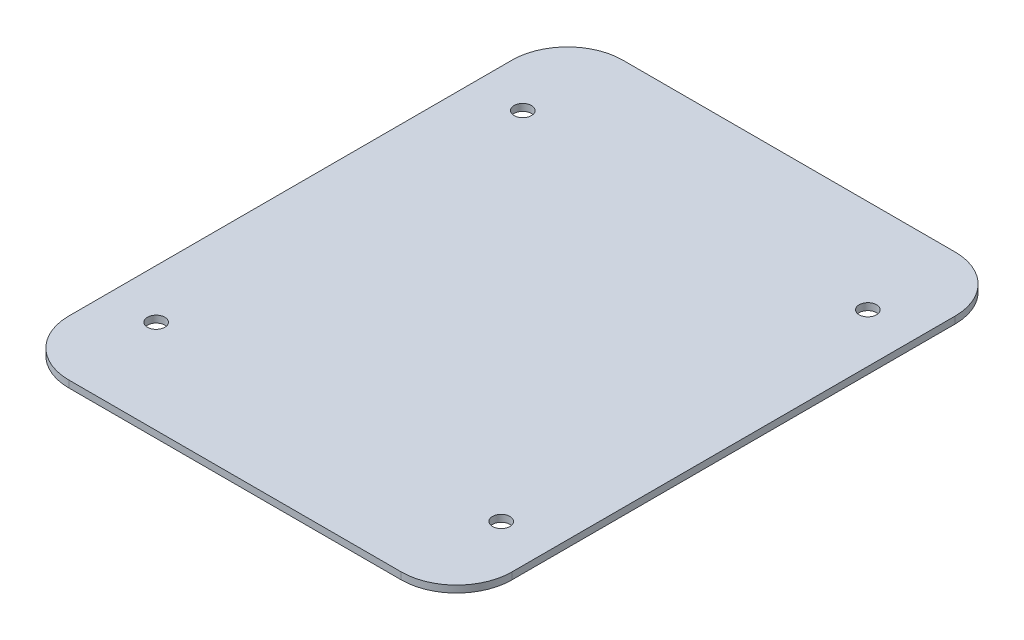
ISO-10303-21;
HEADER;
FILE_DESCRIPTION(('STEP AP214'),'2;1');
FILE_NAME('part.step','',(''),(''),'','','');
FILE_SCHEMA(('AUTOMOTIVE_DESIGN { 1 0 10303 214 1 1 1 1 }'));
ENDSEC;
DATA;
#1=APPLICATION_CONTEXT('core data for automotive mechanical design processes');
#2=APPLICATION_PROTOCOL_DEFINITION('international standard','automotive_design',2000,#1);
#3=PRODUCT_CONTEXT('',#1,'mechanical');
#4=PRODUCT('Part','Part','',(#3));
#5=PRODUCT_RELATED_PRODUCT_CATEGORY('part','',(#4));
#6=PRODUCT_DEFINITION_FORMATION('','',#4);
#7=PRODUCT_DEFINITION_CONTEXT('part definition',#1,'design');
#8=PRODUCT_DEFINITION('design','',#6,#7);
#9=PRODUCT_DEFINITION_SHAPE('','',#8);
#10=(LENGTH_UNIT() NAMED_UNIT(*) SI_UNIT(.MILLI.,.METRE.));
#11=(NAMED_UNIT(*) PLANE_ANGLE_UNIT() SI_UNIT($,.RADIAN.));
#12=(NAMED_UNIT(*) SI_UNIT($,.STERADIAN.) SOLID_ANGLE_UNIT());
#13=UNCERTAINTY_MEASURE_WITH_UNIT(LENGTH_MEASURE(1.E-05),#10,'distance_accuracy_value','');
#14=(GEOMETRIC_REPRESENTATION_CONTEXT(3) GLOBAL_UNCERTAINTY_ASSIGNED_CONTEXT((#13)) GLOBAL_UNIT_ASSIGNED_CONTEXT((#10,
#11,#12)) REPRESENTATION_CONTEXT('',''));
#15=CARTESIAN_POINT('',(0.,0.,0.));
#16=DIRECTION('',(0.,0.,1.));
#17=DIRECTION('',(1.,0.,0.));
#18=AXIS2_PLACEMENT_3D('',#15,#16,#17);
#19=CARTESIAN_POINT('',(101.6,3.175,127.));
#20=DIRECTION('',(-1.,0.,0.));
#21=DIRECTION('',(0.,0.,1.));
#22=AXIS2_PLACEMENT_3D('',#19,#20,#21);
#23=PLANE('',#22);
#24=DIRECTION('',(0.,0.,-1.));
#25=VECTOR('',#24,1.);
#26=CARTESIAN_POINT('',(101.6,0.,127.));
#27=LINE('',#26,#25);
#28=CARTESIAN_POINT('',(101.6,0.,101.6));
#29=VERTEX_POINT('',#28);
#30=CARTESIAN_POINT('',(101.6,0.,-101.6));
#31=VERTEX_POINT('',#30);
#32=EDGE_CURVE('E129',#29,#31,#27,.T.);
#33=ORIENTED_EDGE('',*,*,#32,.T.);
#34=DIRECTION('',(0.,-1.,0.));
#35=VECTOR('',#34,1.);
#36=CARTESIAN_POINT('',(101.6,3.175,-101.6));
#37=LINE('',#36,#35);
#38=CARTESIAN_POINT('',(101.6,3.175,-101.6));
#39=VERTEX_POINT('',#38);
#40=EDGE_CURVE('E11',#31,#39,#37,.F.);
#41=ORIENTED_EDGE('',*,*,#40,.T.);
#42=DIRECTION('',(0.,0.,-1.));
#43=VECTOR('',#42,1.);
#44=CARTESIAN_POINT('',(101.6,3.175,127.));
#45=LINE('',#44,#43);
#46=CARTESIAN_POINT('',(101.6,3.175,101.6));
#47=VERTEX_POINT('',#46);
#48=EDGE_CURVE('E127',#47,#39,#45,.T.);
#49=ORIENTED_EDGE('',*,*,#48,.F.);
#50=DIRECTION('',(0.,-1.,0.));
#51=VECTOR('',#50,1.);
#52=CARTESIAN_POINT('',(101.6,3.175,101.6));
#53=LINE('',#52,#51);
#54=EDGE_CURVE('E41',#47,#29,#53,.T.);
#55=ORIENTED_EDGE('',*,*,#54,.T.);
#56=EDGE_LOOP('',(#33,#41,#49,#55));
#57=FACE_BOUND('',#56,.T.);
#58=ADVANCED_FACE('F33',(#57),#23,.F.);
#59=CARTESIAN_POINT('',(-101.6,3.175,-127.));
#60=DIRECTION('',(0.,0.,1.));
#61=DIRECTION('',(1.,0.,0.));
#62=AXIS2_PLACEMENT_3D('',#59,#60,#61);
#63=PLANE('',#62);
#64=DIRECTION('',(-1.,0.,0.));
#65=VECTOR('',#64,1.);
#66=CARTESIAN_POINT('',(-101.6,0.,-127.));
#67=LINE('',#66,#65);
#68=CARTESIAN_POINT('',(76.2,0.,-127.));
#69=VERTEX_POINT('',#68);
#70=CARTESIAN_POINT('',(-76.2,0.,-127.));
#71=VERTEX_POINT('',#70);
#72=EDGE_CURVE('E125',#69,#71,#67,.T.);
#73=ORIENTED_EDGE('',*,*,#72,.T.);
#74=DIRECTION('',(0.,-1.,0.));
#75=VECTOR('',#74,1.);
#76=CARTESIAN_POINT('',(-76.2,3.175,-127.));
#77=LINE('',#76,#75);
#78=CARTESIAN_POINT('',(-76.2,3.175,-127.));
#79=VERTEX_POINT('',#78);
#80=EDGE_CURVE('E104',#71,#79,#77,.F.);
#81=ORIENTED_EDGE('',*,*,#80,.T.);
#82=DIRECTION('',(-1.,0.,0.));
#83=VECTOR('',#82,1.);
#84=CARTESIAN_POINT('',(-101.6,3.175,-127.));
#85=LINE('',#84,#83);
#86=CARTESIAN_POINT('',(76.2,3.175,-127.));
#87=VERTEX_POINT('',#86);
#88=EDGE_CURVE('E169',#87,#79,#85,.T.);
#89=ORIENTED_EDGE('',*,*,#88,.F.);
#90=DIRECTION('',(0.,-1.,0.));
#91=VECTOR('',#90,1.);
#92=CARTESIAN_POINT('',(76.2,3.175,-127.));
#93=LINE('',#92,#91);
#94=EDGE_CURVE('E109',#87,#69,#93,.T.);
#95=ORIENTED_EDGE('',*,*,#94,.T.);
#96=EDGE_LOOP('',(#73,#81,#89,#95));
#97=FACE_BOUND('',#96,.T.);
#98=ADVANCED_FACE('F218',(#97),#63,.F.);
#99=CARTESIAN_POINT('',(-101.6,3.175,127.));
#100=DIRECTION('',(1.,0.,0.));
#101=DIRECTION('',(0.,0.,-1.));
#102=AXIS2_PLACEMENT_3D('',#99,#100,#101);
#103=PLANE('',#102);
#104=DIRECTION('',(0.,0.,1.));
#105=VECTOR('',#104,1.);
#106=CARTESIAN_POINT('',(-101.6,3.175,127.));
#107=LINE('',#106,#105);
#108=CARTESIAN_POINT('',(-101.6,3.175,-101.6));
#109=VERTEX_POINT('',#108);
#110=CARTESIAN_POINT('',(-101.6,3.175,101.6));
#111=VERTEX_POINT('',#110);
#112=EDGE_CURVE('E118',#109,#111,#107,.T.);
#113=ORIENTED_EDGE('',*,*,#112,.F.);
#114=DIRECTION('',(0.,-1.,0.));
#115=VECTOR('',#114,1.);
#116=CARTESIAN_POINT('',(-101.6,3.175,-101.6));
#117=LINE('',#116,#115);
#118=CARTESIAN_POINT('',(-101.6,0.,-101.6));
#119=VERTEX_POINT('',#118);
#120=EDGE_CURVE('E103',#109,#119,#117,.T.);
#121=ORIENTED_EDGE('',*,*,#120,.T.);
#122=DIRECTION('',(0.,0.,1.));
#123=VECTOR('',#122,1.);
#124=CARTESIAN_POINT('',(-101.6,0.,127.));
#125=LINE('',#124,#123);
#126=CARTESIAN_POINT('',(-101.6,0.,101.6));
#127=VERTEX_POINT('',#126);
#128=EDGE_CURVE('E116',#119,#127,#125,.T.);
#129=ORIENTED_EDGE('',*,*,#128,.T.);
#130=DIRECTION('',(0.,-1.,0.));
#131=VECTOR('',#130,1.);
#132=CARTESIAN_POINT('',(-101.6,3.175,101.6));
#133=LINE('',#132,#131);
#134=EDGE_CURVE('E120',#127,#111,#133,.F.);
#135=ORIENTED_EDGE('',*,*,#134,.T.);
#136=EDGE_LOOP('',(#113,#121,#129,#135));
#137=FACE_BOUND('',#136,.T.);
#138=ADVANCED_FACE('F115',(#137),#103,.F.);
#139=CARTESIAN_POINT('',(-101.6,3.175,127.));
#140=DIRECTION('',(0.,0.,-1.));
#141=DIRECTION('',(-1.,0.,0.));
#142=AXIS2_PLACEMENT_3D('',#139,#140,#141);
#143=PLANE('',#142);
#144=DIRECTION('',(1.,0.,0.));
#145=VECTOR('',#144,1.);
#146=CARTESIAN_POINT('',(-101.6,3.175,127.));
#147=LINE('',#146,#145);
#148=CARTESIAN_POINT('',(-76.2,3.175,127.));
#149=VERTEX_POINT('',#148);
#150=CARTESIAN_POINT('',(76.2,3.175,127.));
#151=VERTEX_POINT('',#150);
#152=EDGE_CURVE('E133',#149,#151,#147,.T.);
#153=ORIENTED_EDGE('',*,*,#152,.F.);
#154=DIRECTION('',(0.,-1.,0.));
#155=VECTOR('',#154,1.);
#156=CARTESIAN_POINT('',(-76.2,3.175,127.));
#157=LINE('',#156,#155);
#158=CARTESIAN_POINT('',(-76.2,0.,127.));
#159=VERTEX_POINT('',#158);
#160=EDGE_CURVE('E150',#149,#159,#157,.T.);
#161=ORIENTED_EDGE('',*,*,#160,.T.);
#162=DIRECTION('',(1.,0.,0.));
#163=VECTOR('',#162,1.);
#164=CARTESIAN_POINT('',(-101.6,0.,127.));
#165=LINE('',#164,#163);
#166=CARTESIAN_POINT('',(76.2,0.,127.));
#167=VERTEX_POINT('',#166);
#168=EDGE_CURVE('E124',#159,#167,#165,.T.);
#169=ORIENTED_EDGE('',*,*,#168,.T.);
#170=DIRECTION('',(0.,-1.,0.));
#171=VECTOR('',#170,1.);
#172=CARTESIAN_POINT('',(76.2,3.175,127.));
#173=LINE('',#172,#171);
#174=EDGE_CURVE('E48',#167,#151,#173,.F.);
#175=ORIENTED_EDGE('',*,*,#174,.T.);
#176=EDGE_LOOP('',(#153,#161,#169,#175));
#177=FACE_BOUND('',#176,.T.);
#178=ADVANCED_FACE('F211',(#177),#143,.F.);
#179=CARTESIAN_POINT('',(0.,3.175,0.));
#180=DIRECTION('',(0.,-1.,0.));
#181=DIRECTION('',(0.,0.,-1.));
#182=AXIS2_PLACEMENT_3D('',#179,#180,#181);
#183=PLANE('',#182);
#184=CARTESIAN_POINT('',(-79.1000000000003,3.175,-84.0500000127844));
#185=DIRECTION('',(0.,-1.,0.));
#186=DIRECTION('',(0.,0.,-1.));
#187=AXIS2_PLACEMENT_3D('',#184,#185,#186);
#188=CIRCLE('',#187,4.00000000000001);
#189=CARTESIAN_POINT('',(-79.1000000000003,3.175,-88.0500000127844));
#190=VERTEX_POINT('',#189);
#191=EDGE_CURVE('E162',#190,#190,#188,.T.);
#192=ORIENTED_EDGE('',*,*,#191,.T.);
#193=EDGE_LOOP('',(#192));
#194=FACE_BOUND('',#193,.T.);
#195=CARTESIAN_POINT('',(79.0999999999987,3.175,-84.0500000127848));
#196=DIRECTION('',(0.,-1.,0.));
#197=DIRECTION('',(0.,0.,-1.));
#198=AXIS2_PLACEMENT_3D('',#195,#196,#197);
#199=CIRCLE('',#198,4.00000000000001);
#200=CARTESIAN_POINT('',(79.0999999999987,3.175,-88.0500000127848));
#201=VERTEX_POINT('',#200);
#202=EDGE_CURVE('E164',#201,#201,#199,.T.);
#203=ORIENTED_EDGE('',*,*,#202,.T.);
#204=EDGE_LOOP('',(#203));
#205=FACE_BOUND('',#204,.T.);
#206=CARTESIAN_POINT('',(79.1000000000002,3.175,84.0500000127843));
#207=DIRECTION('',(0.,-1.,0.));
#208=DIRECTION('',(0.,0.,-1.));
#209=AXIS2_PLACEMENT_3D('',#206,#207,#208);
#210=CIRCLE('',#209,4.00000000000001);
#211=CARTESIAN_POINT('',(79.1000000000002,3.175,80.0500000127843));
#212=VERTEX_POINT('',#211);
#213=EDGE_CURVE('E175',#212,#212,#210,.T.);
#214=ORIENTED_EDGE('',*,*,#213,.T.);
#215=EDGE_LOOP('',(#214));
#216=FACE_BOUND('',#215,.T.);
#217=CARTESIAN_POINT('',(-79.1000000000001,3.175,84.0500000127843));
#218=DIRECTION('',(0.,-1.,0.));
#219=DIRECTION('',(0.,0.,-1.));
#220=AXIS2_PLACEMENT_3D('',#217,#218,#219);
#221=CIRCLE('',#220,4.00000000000001);
#222=CARTESIAN_POINT('',(-79.1000000000001,3.175,80.0500000127843));
#223=VERTEX_POINT('',#222);
#224=EDGE_CURVE('E178',#223,#223,#221,.T.);
#225=ORIENTED_EDGE('',*,*,#224,.T.);
#226=EDGE_LOOP('',(#225));
#227=FACE_BOUND('',#226,.T.);
#228=ORIENTED_EDGE('',*,*,#88,.T.);
#229=CARTESIAN_POINT('',(-76.2,3.175,-101.6));
#230=DIRECTION('',(0.,-1.,0.));
#231=DIRECTION('',(0.,0.,-1.));
#232=AXIS2_PLACEMENT_3D('',#229,#230,#231);
#233=CIRCLE('',#232,25.4);
#234=EDGE_CURVE('E147',#79,#109,#233,.F.);
#235=ORIENTED_EDGE('',*,*,#234,.T.);
#236=ORIENTED_EDGE('',*,*,#112,.T.);
#237=CARTESIAN_POINT('',(-76.2,3.175,101.6));
#238=DIRECTION('',(0.,-1.,0.));
#239=DIRECTION('',(0.,0.,-1.));
#240=AXIS2_PLACEMENT_3D('',#237,#238,#239);
#241=CIRCLE('',#240,25.4);
#242=EDGE_CURVE('E55',#111,#149,#241,.F.);
#243=ORIENTED_EDGE('',*,*,#242,.T.);
#244=ORIENTED_EDGE('',*,*,#152,.T.);
#245=CARTESIAN_POINT('',(76.2,3.175,101.6));
#246=DIRECTION('',(0.,-1.,0.));
#247=DIRECTION('',(0.,0.,-1.));
#248=AXIS2_PLACEMENT_3D('',#245,#246,#247);
#249=CIRCLE('',#248,25.4);
#250=EDGE_CURVE('E142',#151,#47,#249,.F.);
#251=ORIENTED_EDGE('',*,*,#250,.T.);
#252=ORIENTED_EDGE('',*,*,#48,.T.);
#253=CARTESIAN_POINT('',(76.2,3.175,-101.6));
#254=DIRECTION('',(0.,-1.,0.));
#255=DIRECTION('',(0.,0.,-1.));
#256=AXIS2_PLACEMENT_3D('',#253,#254,#255);
#257=CIRCLE('',#256,25.4);
#258=EDGE_CURVE('E144',#39,#87,#257,.F.);
#259=ORIENTED_EDGE('',*,*,#258,.T.);
#260=EDGE_LOOP('',(#228,#235,#236,#243,#244,#251,#252,#259));
#261=FACE_BOUND('',#260,.T.);
#262=ADVANCED_FACE('F199',(#194,#205,#216,#227,#261),#183,.F.);
#263=CARTESIAN_POINT('',(0.,0.,0.));
#264=DIRECTION('',(0.,-1.,0.));
#265=DIRECTION('',(0.,0.,-1.));
#266=AXIS2_PLACEMENT_3D('',#263,#264,#265);
#267=PLANE('',#266);
#268=CARTESIAN_POINT('',(-79.1000000000003,0.,-84.0500000127844));
#269=DIRECTION('',(0.,-1.,0.));
#270=DIRECTION('',(0.,0.,-1.));
#271=AXIS2_PLACEMENT_3D('',#268,#269,#270);
#272=CIRCLE('',#271,4.00000000000001);
#273=CARTESIAN_POINT('',(-79.1000000000003,0.,-88.0500000127844));
#274=VERTEX_POINT('',#273);
#275=EDGE_CURVE('E185',#274,#274,#272,.T.);
#276=ORIENTED_EDGE('',*,*,#275,.F.);
#277=EDGE_LOOP('',(#276));
#278=FACE_BOUND('',#277,.T.);
#279=CARTESIAN_POINT('',(79.0999999999987,0.,-84.0500000127848));
#280=DIRECTION('',(0.,-1.,0.));
#281=DIRECTION('',(0.,0.,-1.));
#282=AXIS2_PLACEMENT_3D('',#279,#280,#281);
#283=CIRCLE('',#282,4.00000000000001);
#284=CARTESIAN_POINT('',(79.0999999999987,0.,-88.0500000127848));
#285=VERTEX_POINT('',#284);
#286=EDGE_CURVE('E188',#285,#285,#283,.T.);
#287=ORIENTED_EDGE('',*,*,#286,.F.);
#288=EDGE_LOOP('',(#287));
#289=FACE_BOUND('',#288,.T.);
#290=CARTESIAN_POINT('',(79.1000000000002,0.,84.0500000127843));
#291=DIRECTION('',(0.,-1.,0.));
#292=DIRECTION('',(0.,0.,-1.));
#293=AXIS2_PLACEMENT_3D('',#290,#291,#292);
#294=CIRCLE('',#293,4.00000000000001);
#295=CARTESIAN_POINT('',(79.1000000000002,0.,80.0500000127843));
#296=VERTEX_POINT('',#295);
#297=EDGE_CURVE('E184',#296,#296,#294,.T.);
#298=ORIENTED_EDGE('',*,*,#297,.F.);
#299=EDGE_LOOP('',(#298));
#300=FACE_BOUND('',#299,.T.);
#301=CARTESIAN_POINT('',(-79.1000000000001,0.,84.0500000127843));
#302=DIRECTION('',(0.,-1.,0.));
#303=DIRECTION('',(0.,0.,-1.));
#304=AXIS2_PLACEMENT_3D('',#301,#302,#303);
#305=CIRCLE('',#304,4.00000000000001);
#306=CARTESIAN_POINT('',(-79.1000000000001,0.,80.0500000127843));
#307=VERTEX_POINT('',#306);
#308=EDGE_CURVE('E181',#307,#307,#305,.T.);
#309=ORIENTED_EDGE('',*,*,#308,.F.);
#310=EDGE_LOOP('',(#309));
#311=FACE_BOUND('',#310,.T.);
#312=ORIENTED_EDGE('',*,*,#128,.F.);
#313=CARTESIAN_POINT('',(-76.2,0.,-101.6));
#314=DIRECTION('',(0.,-1.,0.));
#315=DIRECTION('',(0.,0.,-1.));
#316=AXIS2_PLACEMENT_3D('',#313,#314,#315);
#317=CIRCLE('',#316,25.4);
#318=EDGE_CURVE('E99',#119,#71,#317,.T.);
#319=ORIENTED_EDGE('',*,*,#318,.T.);
#320=ORIENTED_EDGE('',*,*,#72,.F.);
#321=CARTESIAN_POINT('',(76.2,0.,-101.6));
#322=DIRECTION('',(0.,-1.,0.));
#323=DIRECTION('',(0.,0.,-1.));
#324=AXIS2_PLACEMENT_3D('',#321,#322,#323);
#325=CIRCLE('',#324,25.4);
#326=EDGE_CURVE('E136',#69,#31,#325,.T.);
#327=ORIENTED_EDGE('',*,*,#326,.T.);
#328=ORIENTED_EDGE('',*,*,#32,.F.);
#329=CARTESIAN_POINT('',(76.2,0.,101.6));
#330=DIRECTION('',(0.,-1.,0.));
#331=DIRECTION('',(0.,0.,-1.));
#332=AXIS2_PLACEMENT_3D('',#329,#330,#331);
#333=CIRCLE('',#332,25.4);
#334=EDGE_CURVE('E119',#29,#167,#333,.T.);
#335=ORIENTED_EDGE('',*,*,#334,.T.);
#336=ORIENTED_EDGE('',*,*,#168,.F.);
#337=CARTESIAN_POINT('',(-76.2,0.,101.6));
#338=DIRECTION('',(0.,-1.,0.));
#339=DIRECTION('',(0.,0.,-1.));
#340=AXIS2_PLACEMENT_3D('',#337,#338,#339);
#341=CIRCLE('',#340,25.4);
#342=EDGE_CURVE('E110',#159,#127,#341,.T.);
#343=ORIENTED_EDGE('',*,*,#342,.T.);
#344=EDGE_LOOP('',(#312,#319,#320,#327,#328,#335,#336,#343));
#345=FACE_BOUND('',#344,.T.);
#346=ADVANCED_FACE('F122',(#278,#289,#300,#311,#345),#267,.T.);
#347=CARTESIAN_POINT('',(-76.2,3.175,-101.6));
#348=DIRECTION('',(0.,-1.,0.));
#349=DIRECTION('',(0.,0.,-1.));
#350=AXIS2_PLACEMENT_3D('',#347,#348,#349);
#351=CYLINDRICAL_SURFACE('',#350,25.4);
#352=ORIENTED_EDGE('',*,*,#234,.F.);
#353=ORIENTED_EDGE('',*,*,#80,.F.);
#354=ORIENTED_EDGE('',*,*,#318,.F.);
#355=ORIENTED_EDGE('',*,*,#120,.F.);
#356=EDGE_LOOP('',(#352,#353,#354,#355));
#357=FACE_BOUND('',#356,.T.);
#358=ADVANCED_FACE('F102',(#357),#351,.T.);
#359=CARTESIAN_POINT('',(-76.2,3.175,101.6));
#360=DIRECTION('',(0.,-1.,0.));
#361=DIRECTION('',(0.,0.,-1.));
#362=AXIS2_PLACEMENT_3D('',#359,#360,#361);
#363=CYLINDRICAL_SURFACE('',#362,25.4);
#364=ORIENTED_EDGE('',*,*,#242,.F.);
#365=ORIENTED_EDGE('',*,*,#134,.F.);
#366=ORIENTED_EDGE('',*,*,#342,.F.);
#367=ORIENTED_EDGE('',*,*,#160,.F.);
#368=EDGE_LOOP('',(#364,#365,#366,#367));
#369=FACE_BOUND('',#368,.T.);
#370=ADVANCED_FACE('F225',(#369),#363,.T.);
#371=CARTESIAN_POINT('',(76.2,3.175,-101.6));
#372=DIRECTION('',(0.,-1.,0.));
#373=DIRECTION('',(0.,0.,-1.));
#374=AXIS2_PLACEMENT_3D('',#371,#372,#373);
#375=CYLINDRICAL_SURFACE('',#374,25.4);
#376=ORIENTED_EDGE('',*,*,#258,.F.);
#377=ORIENTED_EDGE('',*,*,#40,.F.);
#378=ORIENTED_EDGE('',*,*,#326,.F.);
#379=ORIENTED_EDGE('',*,*,#94,.F.);
#380=EDGE_LOOP('',(#376,#377,#378,#379));
#381=FACE_BOUND('',#380,.T.);
#382=ADVANCED_FACE('F220',(#381),#375,.T.);
#383=CARTESIAN_POINT('',(76.2,3.175,101.6));
#384=DIRECTION('',(0.,-1.,0.));
#385=DIRECTION('',(0.,0.,-1.));
#386=AXIS2_PLACEMENT_3D('',#383,#384,#385);
#387=CYLINDRICAL_SURFACE('',#386,25.4);
#388=ORIENTED_EDGE('',*,*,#250,.F.);
#389=ORIENTED_EDGE('',*,*,#174,.F.);
#390=ORIENTED_EDGE('',*,*,#334,.F.);
#391=ORIENTED_EDGE('',*,*,#54,.F.);
#392=EDGE_LOOP('',(#388,#389,#390,#391));
#393=FACE_BOUND('',#392,.T.);
#394=ADVANCED_FACE('F35',(#393),#387,.T.);
#395=CARTESIAN_POINT('',(-79.1000000000001,25.4,84.0500000127843));
#396=DIRECTION('',(0.,-1.,0.));
#397=DIRECTION('',(0.,0.,-1.));
#398=AXIS2_PLACEMENT_3D('',#395,#396,#397);
#399=CYLINDRICAL_SURFACE('',#398,4.00000000000001);
#400=ORIENTED_EDGE('',*,*,#308,.T.);
#401=EDGE_LOOP('',(#400));
#402=FACE_BOUND('',#401,.T.);
#403=ORIENTED_EDGE('',*,*,#224,.F.);
#404=EDGE_LOOP('',(#403));
#405=FACE_BOUND('',#404,.T.);
#406=ADVANCED_FACE('F204',(#402,#405),#399,.F.);
#407=CARTESIAN_POINT('',(79.1000000000002,25.4,84.0500000127843));
#408=DIRECTION('',(0.,-1.,0.));
#409=DIRECTION('',(0.,0.,-1.));
#410=AXIS2_PLACEMENT_3D('',#407,#408,#409);
#411=CYLINDRICAL_SURFACE('',#410,4.00000000000001);
#412=ORIENTED_EDGE('',*,*,#297,.T.);
#413=EDGE_LOOP('',(#412));
#414=FACE_BOUND('',#413,.T.);
#415=ORIENTED_EDGE('',*,*,#213,.F.);
#416=EDGE_LOOP('',(#415));
#417=FACE_BOUND('',#416,.T.);
#418=ADVANCED_FACE('F194',(#414,#417),#411,.F.);
#419=CARTESIAN_POINT('',(79.0999999999987,25.4,-84.0500000127848));
#420=DIRECTION('',(0.,-1.,0.));
#421=DIRECTION('',(0.,0.,-1.));
#422=AXIS2_PLACEMENT_3D('',#419,#420,#421);
#423=CYLINDRICAL_SURFACE('',#422,4.00000000000001);
#424=ORIENTED_EDGE('',*,*,#286,.T.);
#425=EDGE_LOOP('',(#424));
#426=FACE_BOUND('',#425,.T.);
#427=ORIENTED_EDGE('',*,*,#202,.F.);
#428=EDGE_LOOP('',(#427));
#429=FACE_BOUND('',#428,.T.);
#430=ADVANCED_FACE('F251',(#426,#429),#423,.F.);
#431=CARTESIAN_POINT('',(-79.1000000000003,25.4,-84.0500000127844));
#432=DIRECTION('',(0.,-1.,0.));
#433=DIRECTION('',(0.,0.,-1.));
#434=AXIS2_PLACEMENT_3D('',#431,#432,#433);
#435=CYLINDRICAL_SURFACE('',#434,4.00000000000001);
#436=ORIENTED_EDGE('',*,*,#275,.T.);
#437=EDGE_LOOP('',(#436));
#438=FACE_BOUND('',#437,.T.);
#439=ORIENTED_EDGE('',*,*,#191,.F.);
#440=EDGE_LOOP('',(#439));
#441=FACE_BOUND('',#440,.T.);
#442=ADVANCED_FACE('F248',(#438,#441),#435,.F.);
#443=CLOSED_SHELL('',(#58,#98,#138,#178,#262,#346,#358,#370,#382,#394,#406,#418,#430,#442));
#444=MANIFOLD_SOLID_BREP('B2',#443);
#445=ADVANCED_BREP_SHAPE_REPRESENTATION('',(#18,#444),#14);
#446=SHAPE_DEFINITION_REPRESENTATION(#9,#445);
ENDSEC;
END-ISO-10303-21;
